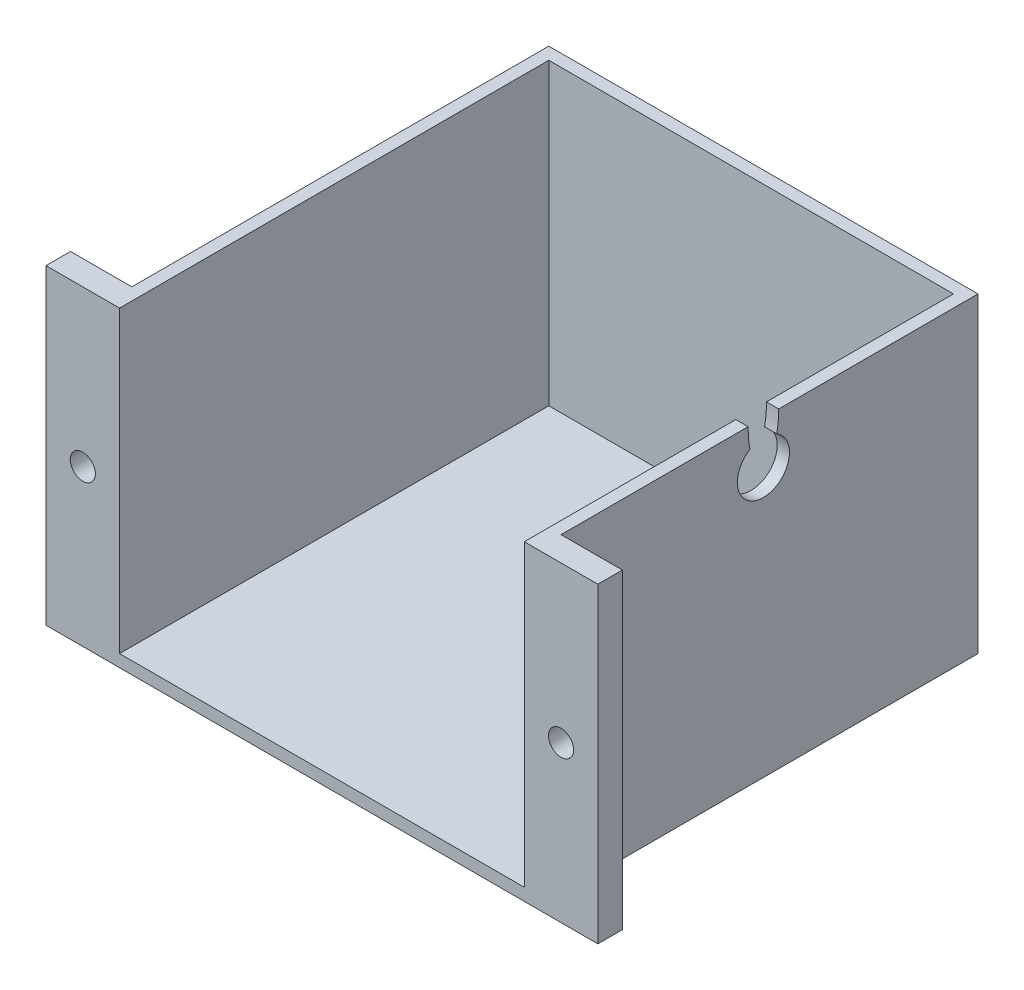
ISO-10303-21;
HEADER;
FILE_DESCRIPTION(('STEP AP214'),'2;1');
FILE_NAME('part.step','',(''),(''),'','','');
FILE_SCHEMA(('AUTOMOTIVE_DESIGN { 1 0 10303 214 1 1 1 1 }'));
ENDSEC;
DATA;
#1=APPLICATION_CONTEXT('core data for automotive mechanical design processes');
#2=APPLICATION_PROTOCOL_DEFINITION('international standard','automotive_design',2000,#1);
#3=PRODUCT_CONTEXT('',#1,'mechanical');
#4=PRODUCT('Part','Part','',(#3));
#5=PRODUCT_RELATED_PRODUCT_CATEGORY('part','',(#4));
#6=PRODUCT_DEFINITION_FORMATION('','',#4);
#7=PRODUCT_DEFINITION_CONTEXT('part definition',#1,'design');
#8=PRODUCT_DEFINITION('design','',#6,#7);
#9=PRODUCT_DEFINITION_SHAPE('','',#8);
#10=(LENGTH_UNIT() NAMED_UNIT(*) SI_UNIT(.MILLI.,.METRE.));
#11=(NAMED_UNIT(*) PLANE_ANGLE_UNIT() SI_UNIT($,.RADIAN.));
#12=(NAMED_UNIT(*) SI_UNIT($,.STERADIAN.) SOLID_ANGLE_UNIT());
#13=UNCERTAINTY_MEASURE_WITH_UNIT(LENGTH_MEASURE(1.E-05),#10,'distance_accuracy_value','');
#14=(GEOMETRIC_REPRESENTATION_CONTEXT(3) GLOBAL_UNCERTAINTY_ASSIGNED_CONTEXT((#13)) GLOBAL_UNIT_ASSIGNED_CONTEXT((#10,
#11,#12)) REPRESENTATION_CONTEXT('',''));
#15=CARTESIAN_POINT('',(0.,0.,0.));
#16=DIRECTION('',(0.,0.,1.));
#17=DIRECTION('',(1.,0.,0.));
#18=AXIS2_PLACEMENT_3D('',#15,#16,#17);
#19=CARTESIAN_POINT('',(0.,50.8,0.));
#20=DIRECTION('',(0.,-1.,0.));
#21=DIRECTION('',(0.,0.,-1.));
#22=AXIS2_PLACEMENT_3D('',#19,#20,#21);
#23=PLANE('',#22);
#24=DIRECTION('',(0.,0.,-1.));
#25=VECTOR('',#24,1.);
#26=CARTESIAN_POINT('',(70.,50.8,-68.));
#27=LINE('',#26,#25);
#28=CARTESIAN_POINT('',(70.,50.8,0.));
#29=VERTEX_POINT('',#28);
#30=CARTESIAN_POINT('',(70.,50.8,-30.5));
#31=VERTEX_POINT('',#30);
#32=EDGE_CURVE('E170',#29,#31,#27,.T.);
#33=ORIENTED_EDGE('',*,*,#32,.T.);
#34=DIRECTION('',(1.,0.,0.));
#35=VECTOR('',#34,1.);
#36=CARTESIAN_POINT('',(-10.001,50.8,-30.5));
#37=LINE('',#36,#35);
#38=CARTESIAN_POINT('',(68.,50.8,-30.5));
#39=VERTEX_POINT('',#38);
#40=EDGE_CURVE('E155',#39,#31,#37,.T.);
#41=ORIENTED_EDGE('',*,*,#40,.F.);
#42=DIRECTION('',(0.,0.,1.));
#43=VECTOR('',#42,1.);
#44=CARTESIAN_POINT('',(68.,50.8,3.99999999999999));
#45=LINE('',#44,#43);
#46=CARTESIAN_POINT('',(68.,50.8,3.99999999999999));
#47=VERTEX_POINT('',#46);
#48=EDGE_CURVE('E167',#39,#47,#45,.T.);
#49=ORIENTED_EDGE('',*,*,#48,.T.);
#50=DIRECTION('',(1.,0.,0.));
#51=VECTOR('',#50,1.);
#52=CARTESIAN_POINT('',(80.,50.8,3.99999999999999));
#53=LINE('',#52,#51);
#54=CARTESIAN_POINT('',(80.,50.8,3.99999999999999));
#55=VERTEX_POINT('',#54);
#56=EDGE_CURVE('E181',#47,#55,#53,.T.);
#57=ORIENTED_EDGE('',*,*,#56,.T.);
#58=DIRECTION('',(0.,0.,-1.));
#59=VECTOR('',#58,1.);
#60=CARTESIAN_POINT('',(80.,50.8,0.));
#61=LINE('',#60,#59);
#62=CARTESIAN_POINT('',(80.,50.8,0.));
#63=VERTEX_POINT('',#62);
#64=EDGE_CURVE('E187',#55,#63,#61,.T.);
#65=ORIENTED_EDGE('',*,*,#64,.T.);
#66=DIRECTION('',(-1.,0.,0.));
#67=VECTOR('',#66,1.);
#68=CARTESIAN_POINT('',(70.,50.8,0.));
#69=LINE('',#68,#67);
#70=EDGE_CURVE('E189',#63,#29,#69,.T.);
#71=ORIENTED_EDGE('',*,*,#70,.T.);
#72=EDGE_LOOP('',(#33,#41,#49,#57,#65,#71));
#73=FACE_BOUND('',#72,.T.);
#74=ADVANCED_FACE('F39',(#73),#23,.F.);
#75=CARTESIAN_POINT('',(2.,50.8,-66.));
#76=DIRECTION('',(-1.,0.,0.));
#77=DIRECTION('',(0.,0.,1.));
#78=AXIS2_PLACEMENT_3D('',#75,#76,#77);
#79=PLANE('',#78);
#80=DIRECTION('',(0.,0.,-1.));
#81=VECTOR('',#80,1.);
#82=CARTESIAN_POINT('',(1.99999999999998,2.,4.));
#83=LINE('',#82,#81);
#84=CARTESIAN_POINT('',(2.00000000000001,2.,4.));
#85=VERTEX_POINT('',#84);
#86=CARTESIAN_POINT('',(2.,2.,-66.));
#87=VERTEX_POINT('',#86);
#88=EDGE_CURVE('E257',#85,#87,#83,.T.);
#89=ORIENTED_EDGE('',*,*,#88,.T.);
#90=DIRECTION('',(0.,-1.,0.));
#91=VECTOR('',#90,1.);
#92=CARTESIAN_POINT('',(2.,50.8,-66.));
#93=LINE('',#92,#91);
#94=CARTESIAN_POINT('',(2.,50.8,-66.));
#95=VERTEX_POINT('',#94);
#96=EDGE_CURVE('E243',#95,#87,#93,.T.);
#97=ORIENTED_EDGE('',*,*,#96,.F.);
#98=DIRECTION('',(0.,0.,-1.));
#99=VECTOR('',#98,1.);
#100=CARTESIAN_POINT('',(2.,50.8,-66.));
#101=LINE('',#100,#99);
#102=CARTESIAN_POINT('',(2.00000000000001,50.8,4.));
#103=VERTEX_POINT('',#102);
#104=EDGE_CURVE('E182',#103,#95,#101,.T.);
#105=ORIENTED_EDGE('',*,*,#104,.F.);
#106=DIRECTION('',(0.,-1.,0.));
#107=VECTOR('',#106,1.);
#108=CARTESIAN_POINT('',(2.00000000000001,50.8,4.));
#109=LINE('',#108,#107);
#110=EDGE_CURVE('E47',#103,#85,#109,.T.);
#111=ORIENTED_EDGE('',*,*,#110,.T.);
#112=EDGE_LOOP('',(#89,#97,#105,#111));
#113=FACE_BOUND('',#112,.T.);
#114=ADVANCED_FACE('F274',(#113),#79,.F.);
#115=CARTESIAN_POINT('',(68.,50.8,-66.));
#116=DIRECTION('',(0.,0.,-1.));
#117=DIRECTION('',(-1.,0.,0.));
#118=AXIS2_PLACEMENT_3D('',#115,#116,#117);
#119=PLANE('',#118);
#120=DIRECTION('',(-1.,0.,0.));
#121=VECTOR('',#120,1.);
#122=CARTESIAN_POINT('',(1.99999999999998,2.,-66.));
#123=LINE('',#122,#121);
#124=CARTESIAN_POINT('',(68.,2.,-66.));
#125=VERTEX_POINT('',#124);
#126=EDGE_CURVE('E251',#125,#87,#123,.T.);
#127=ORIENTED_EDGE('',*,*,#126,.F.);
#128=DIRECTION('',(0.,-1.,0.));
#129=VECTOR('',#128,1.);
#130=CARTESIAN_POINT('',(68.,50.8,-66.));
#131=LINE('',#130,#129);
#132=CARTESIAN_POINT('',(68.,50.8,-66.));
#133=VERTEX_POINT('',#132);
#134=EDGE_CURVE('E240',#133,#125,#131,.T.);
#135=ORIENTED_EDGE('',*,*,#134,.F.);
#136=DIRECTION('',(1.,0.,0.));
#137=VECTOR('',#136,1.);
#138=CARTESIAN_POINT('',(68.,50.8,-66.));
#139=LINE('',#138,#137);
#140=EDGE_CURVE('E178',#95,#133,#139,.T.);
#141=ORIENTED_EDGE('',*,*,#140,.F.);
#142=ORIENTED_EDGE('',*,*,#96,.T.);
#143=EDGE_LOOP('',(#127,#135,#141,#142));
#144=FACE_BOUND('',#143,.T.);
#145=ADVANCED_FACE('F249',(#144),#119,.F.);
#146=CARTESIAN_POINT('',(68.,50.8,3.99999999999999));
#147=DIRECTION('',(1.,0.,0.));
#148=DIRECTION('',(0.,0.,-1.));
#149=AXIS2_PLACEMENT_3D('',#146,#147,#148);
#150=PLANE('',#149);
#151=ORIENTED_EDGE('',*,*,#48,.F.);
#152=CARTESIAN_POINT('',(68.,50.8,-33.));
#153=DIRECTION('',(1.,0.,0.));
#154=DIRECTION('',(0.,-1.,0.));
#155=AXIS2_PLACEMENT_3D('',#152,#153,#154);
#156=ELLIPSE('',#155,7.,2.50000000000001);
#157=CARTESIAN_POINT('',(68.,47.4403563768322,-30.8067591446317));
#158=VERTEX_POINT('',#157);
#159=EDGE_CURVE('E151',#158,#39,#156,.F.);
#160=ORIENTED_EDGE('',*,*,#159,.F.);
#161=CARTESIAN_POINT('',(68.,43.8,-33.));
#162=DIRECTION('',(1.,0.,0.));
#163=DIRECTION('',(0.,0.,-1.));
#164=AXIS2_PLACEMENT_3D('',#161,#162,#163);
#165=CIRCLE('',#164,4.25);
#166=CARTESIAN_POINT('',(68.,47.4403563768322,-35.1932408553683));
#167=VERTEX_POINT('',#166);
#168=EDGE_CURVE('E163',#167,#158,#165,.F.);
#169=ORIENTED_EDGE('',*,*,#168,.F.);
#170=CARTESIAN_POINT('',(68.,50.8,-33.));
#171=DIRECTION('',(1.,0.,0.));
#172=DIRECTION('',(0.,-1.,0.));
#173=AXIS2_PLACEMENT_3D('',#170,#171,#172);
#174=ELLIPSE('',#173,7.,2.50000000000001);
#175=CARTESIAN_POINT('',(68.,50.8,-35.5));
#176=VERTEX_POINT('',#175);
#177=EDGE_CURVE('E162',#176,#167,#174,.F.);
#178=ORIENTED_EDGE('',*,*,#177,.F.);
#179=EDGE_CURVE('E177',#133,#176,#45,.T.);
#180=ORIENTED_EDGE('',*,*,#179,.F.);
#181=ORIENTED_EDGE('',*,*,#134,.T.);
#182=DIRECTION('',(0.,0.,-1.));
#183=VECTOR('',#182,1.);
#184=CARTESIAN_POINT('',(68.,2.,4.));
#185=LINE('',#184,#183);
#186=CARTESIAN_POINT('',(68.,2.,3.99999999999999));
#187=VERTEX_POINT('',#186);
#188=EDGE_CURVE('E204',#187,#125,#185,.T.);
#189=ORIENTED_EDGE('',*,*,#188,.F.);
#190=DIRECTION('',(0.,-1.,0.));
#191=VECTOR('',#190,1.);
#192=CARTESIAN_POINT('',(68.,50.8,3.99999999999999));
#193=LINE('',#192,#191);
#194=EDGE_CURVE('E175',#47,#187,#193,.T.);
#195=ORIENTED_EDGE('',*,*,#194,.F.);
#196=EDGE_LOOP('',(#151,#160,#169,#178,#180,#181,#189,#195));
#197=FACE_BOUND('',#196,.T.);
#198=ADVANCED_FACE('F173',(#197),#150,.F.);
#199=CARTESIAN_POINT('',(-9.99999999999999,50.8,4.));
#200=DIRECTION('',(1.,0.,0.));
#201=DIRECTION('',(0.,0.,-1.));
#202=AXIS2_PLACEMENT_3D('',#199,#200,#201);
#203=PLANE('',#202);
#204=DIRECTION('',(0.,0.,1.));
#205=VECTOR('',#204,1.);
#206=CARTESIAN_POINT('',(-9.99999999999999,0.,4.));
#207=LINE('',#206,#205);
#208=CARTESIAN_POINT('',(-9.99999999999999,0.,0.));
#209=VERTEX_POINT('',#208);
#210=CARTESIAN_POINT('',(-9.99999999999999,0.,4.));
#211=VERTEX_POINT('',#210);
#212=EDGE_CURVE('E200',#209,#211,#207,.T.);
#213=ORIENTED_EDGE('',*,*,#212,.T.);
#214=DIRECTION('',(0.,-1.,0.));
#215=VECTOR('',#214,1.);
#216=CARTESIAN_POINT('',(-9.99999999999999,50.8,4.));
#217=LINE('',#216,#215);
#218=CARTESIAN_POINT('',(-9.99999999999999,50.8,4.));
#219=VERTEX_POINT('',#218);
#220=EDGE_CURVE('E11',#219,#211,#217,.T.);
#221=ORIENTED_EDGE('',*,*,#220,.F.);
#222=DIRECTION('',(0.,0.,1.));
#223=VECTOR('',#222,1.);
#224=CARTESIAN_POINT('',(-9.99999999999999,50.8,4.));
#225=LINE('',#224,#223);
#226=CARTESIAN_POINT('',(-9.99999999999999,50.8,0.));
#227=VERTEX_POINT('',#226);
#228=EDGE_CURVE('E218',#227,#219,#225,.T.);
#229=ORIENTED_EDGE('',*,*,#228,.F.);
#230=DIRECTION('',(0.,-1.,0.));
#231=VECTOR('',#230,1.);
#232=CARTESIAN_POINT('',(-9.99999999999999,50.8,0.));
#233=LINE('',#232,#231);
#234=EDGE_CURVE('E199',#227,#209,#233,.T.);
#235=ORIENTED_EDGE('',*,*,#234,.T.);
#236=EDGE_LOOP('',(#213,#221,#229,#235));
#237=FACE_BOUND('',#236,.T.);
#238=ADVANCED_FACE('F41',(#237),#203,.F.);
#239=CARTESIAN_POINT('',(80.,50.8,3.99999999999999));
#240=DIRECTION('',(0.,0.,-1.));
#241=DIRECTION('',(-1.,0.,0.));
#242=AXIS2_PLACEMENT_3D('',#239,#240,#241);
#243=PLANE('',#242);
#244=CARTESIAN_POINT('',(74.,25.4,4.));
#245=DIRECTION('',(0.,0.,1.));
#246=DIRECTION('',(1.,0.,0.));
#247=AXIS2_PLACEMENT_3D('',#244,#245,#246);
#248=CIRCLE('',#247,2.04999999999999);
#249=CARTESIAN_POINT('',(76.05,25.4,4.));
#250=VERTEX_POINT('',#249);
#251=EDGE_CURVE('E263',#250,#250,#248,.T.);
#252=ORIENTED_EDGE('',*,*,#251,.F.);
#253=EDGE_LOOP('',(#252));
#254=FACE_BOUND('',#253,.T.);
#255=CARTESIAN_POINT('',(-4.,25.4,4.));
#256=DIRECTION('',(0.,0.,1.));
#257=DIRECTION('',(1.,0.,0.));
#258=AXIS2_PLACEMENT_3D('',#255,#256,#257);
#259=CIRCLE('',#258,2.05);
#260=CARTESIAN_POINT('',(-1.95,25.4,4.));
#261=VERTEX_POINT('',#260);
#262=EDGE_CURVE('E340',#261,#261,#259,.T.);
#263=ORIENTED_EDGE('',*,*,#262,.F.);
#264=EDGE_LOOP('',(#263));
#265=FACE_BOUND('',#264,.T.);
#266=DIRECTION('',(1.,0.,0.));
#267=VECTOR('',#266,1.);
#268=CARTESIAN_POINT('',(80.,0.,3.99999999999999));
#269=LINE('',#268,#267);
#270=CARTESIAN_POINT('',(80.,0.,3.99999999999999));
#271=VERTEX_POINT('',#270);
#272=EDGE_CURVE('E203',#211,#271,#269,.T.);
#273=ORIENTED_EDGE('',*,*,#272,.T.);
#274=DIRECTION('',(0.,-1.,0.));
#275=VECTOR('',#274,1.);
#276=CARTESIAN_POINT('',(80.,50.8,3.99999999999999));
#277=LINE('',#276,#275);
#278=EDGE_CURVE('E236',#55,#271,#277,.T.);
#279=ORIENTED_EDGE('',*,*,#278,.F.);
#280=ORIENTED_EDGE('',*,*,#56,.F.);
#281=ORIENTED_EDGE('',*,*,#194,.T.);
#282=DIRECTION('',(-1.,0.,0.));
#283=VECTOR('',#282,1.);
#284=CARTESIAN_POINT('',(1.99999999999998,2.,4.));
#285=LINE('',#284,#283);
#286=EDGE_CURVE('E258',#187,#85,#285,.T.);
#287=ORIENTED_EDGE('',*,*,#286,.T.);
#288=ORIENTED_EDGE('',*,*,#110,.F.);
#289=DIRECTION('',(1.,0.,0.));
#290=VECTOR('',#289,1.);
#291=CARTESIAN_POINT('',(2.00000000000001,50.8,4.));
#292=LINE('',#291,#290);
#293=EDGE_CURVE('E271',#219,#103,#292,.T.);
#294=ORIENTED_EDGE('',*,*,#293,.F.);
#295=ORIENTED_EDGE('',*,*,#220,.T.);
#296=EDGE_LOOP('',(#273,#279,#280,#281,#287,#288,#294,#295));
#297=FACE_BOUND('',#296,.T.);
#298=ADVANCED_FACE('F286',(#254,#265,#297),#243,.F.);
#299=CARTESIAN_POINT('',(80.,50.8,0.));
#300=DIRECTION('',(-1.,0.,0.));
#301=DIRECTION('',(0.,0.,1.));
#302=AXIS2_PLACEMENT_3D('',#299,#300,#301);
#303=PLANE('',#302);
#304=DIRECTION('',(0.,0.,-1.));
#305=VECTOR('',#304,1.);
#306=CARTESIAN_POINT('',(80.,0.,0.));
#307=LINE('',#306,#305);
#308=CARTESIAN_POINT('',(80.,0.,0.));
#309=VERTEX_POINT('',#308);
#310=EDGE_CURVE('E206',#271,#309,#307,.T.);
#311=ORIENTED_EDGE('',*,*,#310,.T.);
#312=DIRECTION('',(0.,-1.,0.));
#313=VECTOR('',#312,1.);
#314=CARTESIAN_POINT('',(80.,50.8,0.));
#315=LINE('',#314,#313);
#316=EDGE_CURVE('E233',#63,#309,#315,.T.);
#317=ORIENTED_EDGE('',*,*,#316,.F.);
#318=ORIENTED_EDGE('',*,*,#64,.F.);
#319=ORIENTED_EDGE('',*,*,#278,.T.);
#320=EDGE_LOOP('',(#311,#317,#318,#319));
#321=FACE_BOUND('',#320,.T.);
#322=ADVANCED_FACE('F289',(#321),#303,.F.);
#323=CARTESIAN_POINT('',(70.,50.8,0.));
#324=DIRECTION('',(0.,0.,1.));
#325=DIRECTION('',(1.,0.,0.));
#326=AXIS2_PLACEMENT_3D('',#323,#324,#325);
#327=PLANE('',#326);
#328=CARTESIAN_POINT('',(74.,25.4,0.));
#329=DIRECTION('',(0.,0.,1.));
#330=DIRECTION('',(1.,0.,0.));
#331=AXIS2_PLACEMENT_3D('',#328,#329,#330);
#332=CIRCLE('',#331,2.04999999999999);
#333=CARTESIAN_POINT('',(76.05,25.4,0.));
#334=VERTEX_POINT('',#333);
#335=EDGE_CURVE('E259',#334,#334,#332,.T.);
#336=ORIENTED_EDGE('',*,*,#335,.T.);
#337=EDGE_LOOP('',(#336));
#338=FACE_BOUND('',#337,.T.);
#339=DIRECTION('',(-1.,0.,0.));
#340=VECTOR('',#339,1.);
#341=CARTESIAN_POINT('',(70.,0.,0.));
#342=LINE('',#341,#340);
#343=CARTESIAN_POINT('',(70.,0.,0.));
#344=VERTEX_POINT('',#343);
#345=EDGE_CURVE('E208',#309,#344,#342,.T.);
#346=ORIENTED_EDGE('',*,*,#345,.T.);
#347=DIRECTION('',(0.,-1.,0.));
#348=VECTOR('',#347,1.);
#349=CARTESIAN_POINT('',(70.,50.8,0.));
#350=LINE('',#349,#348);
#351=EDGE_CURVE('E230',#29,#344,#350,.T.);
#352=ORIENTED_EDGE('',*,*,#351,.F.);
#353=ORIENTED_EDGE('',*,*,#70,.F.);
#354=ORIENTED_EDGE('',*,*,#316,.T.);
#355=EDGE_LOOP('',(#346,#352,#353,#354));
#356=FACE_BOUND('',#355,.T.);
#357=ADVANCED_FACE('F293',(#338,#356),#327,.F.);
#358=CARTESIAN_POINT('',(70.,50.8,-68.));
#359=DIRECTION('',(-1.,0.,0.));
#360=DIRECTION('',(0.,0.,1.));
#361=AXIS2_PLACEMENT_3D('',#358,#359,#360);
#362=PLANE('',#361);
#363=CARTESIAN_POINT('',(70.,43.8,-33.));
#364=DIRECTION('',(1.,0.,0.));
#365=DIRECTION('',(0.,0.,-1.));
#366=AXIS2_PLACEMENT_3D('',#363,#364,#365);
#367=CIRCLE('',#366,4.25);
#368=CARTESIAN_POINT('',(70.,47.4403563768322,-30.8067591446317));
#369=VERTEX_POINT('',#368);
#370=CARTESIAN_POINT('',(70.,47.4403563768322,-35.1932408553683));
#371=VERTEX_POINT('',#370);
#372=EDGE_CURVE('E357',#369,#371,#367,.T.);
#373=ORIENTED_EDGE('',*,*,#372,.F.);
#374=CARTESIAN_POINT('',(70.,50.8,-33.));
#375=DIRECTION('',(1.,0.,0.));
#376=DIRECTION('',(0.,-1.,0.));
#377=AXIS2_PLACEMENT_3D('',#374,#375,#376);
#378=ELLIPSE('',#377,7.,2.50000000000001);
#379=EDGE_CURVE('E352',#31,#369,#378,.T.);
#380=ORIENTED_EDGE('',*,*,#379,.F.);
#381=ORIENTED_EDGE('',*,*,#32,.F.);
#382=ORIENTED_EDGE('',*,*,#351,.T.);
#383=DIRECTION('',(0.,0.,-1.));
#384=VECTOR('',#383,1.);
#385=CARTESIAN_POINT('',(70.,0.,-68.));
#386=LINE('',#385,#384);
#387=CARTESIAN_POINT('',(70.,0.,-68.));
#388=VERTEX_POINT('',#387);
#389=EDGE_CURVE('E210',#344,#388,#386,.T.);
#390=ORIENTED_EDGE('',*,*,#389,.T.);
#391=DIRECTION('',(0.,-1.,0.));
#392=VECTOR('',#391,1.);
#393=CARTESIAN_POINT('',(70.,50.8,-68.));
#394=LINE('',#393,#392);
#395=CARTESIAN_POINT('',(70.,50.8,-68.));
#396=VERTEX_POINT('',#395);
#397=EDGE_CURVE('E227',#396,#388,#394,.T.);
#398=ORIENTED_EDGE('',*,*,#397,.F.);
#399=CARTESIAN_POINT('',(70.,50.8,-35.5));
#400=VERTEX_POINT('',#399);
#401=EDGE_CURVE('E191',#400,#396,#27,.T.);
#402=ORIENTED_EDGE('',*,*,#401,.F.);
#403=CARTESIAN_POINT('',(70.,50.8,-33.));
#404=DIRECTION('',(1.,0.,0.));
#405=DIRECTION('',(0.,-1.,0.));
#406=AXIS2_PLACEMENT_3D('',#403,#404,#405);
#407=ELLIPSE('',#406,7.,2.50000000000001);
#408=EDGE_CURVE('E54',#371,#400,#407,.T.);
#409=ORIENTED_EDGE('',*,*,#408,.F.);
#410=EDGE_LOOP('',(#373,#380,#381,#382,#390,#398,#402,#409));
#411=FACE_BOUND('',#410,.T.);
#412=ADVANCED_FACE('F297',(#411),#362,.F.);
#413=CARTESIAN_POINT('',(0.,50.8,-68.));
#414=DIRECTION('',(0.,0.,1.));
#415=DIRECTION('',(1.,0.,0.));
#416=AXIS2_PLACEMENT_3D('',#413,#414,#415);
#417=PLANE('',#416);
#418=DIRECTION('',(-1.,0.,0.));
#419=VECTOR('',#418,1.);
#420=CARTESIAN_POINT('',(0.,0.,-68.));
#421=LINE('',#420,#419);
#422=CARTESIAN_POINT('',(0.,0.,-68.));
#423=VERTEX_POINT('',#422);
#424=EDGE_CURVE('E212',#388,#423,#421,.T.);
#425=ORIENTED_EDGE('',*,*,#424,.T.);
#426=DIRECTION('',(0.,-1.,0.));
#427=VECTOR('',#426,1.);
#428=CARTESIAN_POINT('',(0.,50.8,-68.));
#429=LINE('',#428,#427);
#430=CARTESIAN_POINT('',(0.,50.8,-68.));
#431=VERTEX_POINT('',#430);
#432=EDGE_CURVE('E224',#431,#423,#429,.T.);
#433=ORIENTED_EDGE('',*,*,#432,.F.);
#434=DIRECTION('',(-1.,0.,0.));
#435=VECTOR('',#434,1.);
#436=CARTESIAN_POINT('',(0.,50.8,-68.));
#437=LINE('',#436,#435);
#438=EDGE_CURVE('E193',#396,#431,#437,.T.);
#439=ORIENTED_EDGE('',*,*,#438,.F.);
#440=ORIENTED_EDGE('',*,*,#397,.T.);
#441=EDGE_LOOP('',(#425,#433,#439,#440));
#442=FACE_BOUND('',#441,.T.);
#443=ADVANCED_FACE('F301',(#442),#417,.F.);
#444=CARTESIAN_POINT('',(0.,50.8,0.));
#445=DIRECTION('',(1.,0.,0.));
#446=DIRECTION('',(0.,0.,-1.));
#447=AXIS2_PLACEMENT_3D('',#444,#445,#446);
#448=PLANE('',#447);
#449=DIRECTION('',(0.,0.,1.));
#450=VECTOR('',#449,1.);
#451=CARTESIAN_POINT('',(0.,0.,0.));
#452=LINE('',#451,#450);
#453=CARTESIAN_POINT('',(0.,0.,0.));
#454=VERTEX_POINT('',#453);
#455=EDGE_CURVE('E214',#423,#454,#452,.T.);
#456=ORIENTED_EDGE('',*,*,#455,.T.);
#457=DIRECTION('',(0.,-1.,0.));
#458=VECTOR('',#457,1.);
#459=CARTESIAN_POINT('',(0.,50.8,0.));
#460=LINE('',#459,#458);
#461=CARTESIAN_POINT('',(0.,50.8,0.));
#462=VERTEX_POINT('',#461);
#463=EDGE_CURVE('E221',#462,#454,#460,.T.);
#464=ORIENTED_EDGE('',*,*,#463,.F.);
#465=DIRECTION('',(0.,0.,1.));
#466=VECTOR('',#465,1.);
#467=CARTESIAN_POINT('',(0.,50.8,0.));
#468=LINE('',#467,#466);
#469=EDGE_CURVE('E195',#431,#462,#468,.T.);
#470=ORIENTED_EDGE('',*,*,#469,.F.);
#471=ORIENTED_EDGE('',*,*,#432,.T.);
#472=EDGE_LOOP('',(#456,#464,#470,#471));
#473=FACE_BOUND('',#472,.T.);
#474=ADVANCED_FACE('F305',(#473),#448,.F.);
#475=CARTESIAN_POINT('',(-9.99999999999999,50.8,0.));
#476=DIRECTION('',(0.,0.,1.));
#477=DIRECTION('',(1.,0.,0.));
#478=AXIS2_PLACEMENT_3D('',#475,#476,#477);
#479=PLANE('',#478);
#480=CARTESIAN_POINT('',(-4.,25.4,0.));
#481=DIRECTION('',(0.,0.,1.));
#482=DIRECTION('',(1.,0.,0.));
#483=AXIS2_PLACEMENT_3D('',#480,#481,#482);
#484=CIRCLE('',#483,2.05);
#485=CARTESIAN_POINT('',(-1.95,25.4,0.));
#486=VERTEX_POINT('',#485);
#487=EDGE_CURVE('E342',#486,#486,#484,.T.);
#488=ORIENTED_EDGE('',*,*,#487,.T.);
#489=EDGE_LOOP('',(#488));
#490=FACE_BOUND('',#489,.T.);
#491=DIRECTION('',(-1.,0.,0.));
#492=VECTOR('',#491,1.);
#493=CARTESIAN_POINT('',(-9.99999999999999,0.,0.));
#494=LINE('',#493,#492);
#495=EDGE_CURVE('E216',#454,#209,#494,.T.);
#496=ORIENTED_EDGE('',*,*,#495,.T.);
#497=ORIENTED_EDGE('',*,*,#234,.F.);
#498=DIRECTION('',(-1.,0.,0.));
#499=VECTOR('',#498,1.);
#500=CARTESIAN_POINT('',(-9.99999999999999,50.8,0.));
#501=LINE('',#500,#499);
#502=EDGE_CURVE('E197',#462,#227,#501,.T.);
#503=ORIENTED_EDGE('',*,*,#502,.F.);
#504=ORIENTED_EDGE('',*,*,#463,.T.);
#505=EDGE_LOOP('',(#496,#497,#503,#504));
#506=FACE_BOUND('',#505,.T.);
#507=ADVANCED_FACE('F308',(#490,#506),#479,.F.);
#508=ORIENTED_EDGE('',*,*,#179,.T.);
#509=DIRECTION('',(1.,0.,0.));
#510=VECTOR('',#509,1.);
#511=CARTESIAN_POINT('',(-10.001,50.8,-35.5));
#512=LINE('',#511,#510);
#513=EDGE_CURVE('E171',#176,#400,#512,.T.);
#514=ORIENTED_EDGE('',*,*,#513,.T.);
#515=ORIENTED_EDGE('',*,*,#401,.T.);
#516=ORIENTED_EDGE('',*,*,#438,.T.);
#517=ORIENTED_EDGE('',*,*,#469,.T.);
#518=ORIENTED_EDGE('',*,*,#502,.T.);
#519=ORIENTED_EDGE('',*,*,#228,.T.);
#520=ORIENTED_EDGE('',*,*,#293,.T.);
#521=ORIENTED_EDGE('',*,*,#104,.T.);
#522=ORIENTED_EDGE('',*,*,#140,.T.);
#523=EDGE_LOOP('',(#508,#514,#515,#516,#517,#518,#519,#520,#521,#522));
#524=FACE_BOUND('',#523,.T.);
#525=ADVANCED_FACE('F273',(#524),#23,.F.);
#526=CARTESIAN_POINT('',(0.,0.,0.));
#527=DIRECTION('',(0.,-1.,0.));
#528=DIRECTION('',(0.,0.,-1.));
#529=AXIS2_PLACEMENT_3D('',#526,#527,#528);
#530=PLANE('',#529);
#531=ORIENTED_EDGE('',*,*,#272,.F.);
#532=ORIENTED_EDGE('',*,*,#212,.F.);
#533=ORIENTED_EDGE('',*,*,#495,.F.);
#534=ORIENTED_EDGE('',*,*,#455,.F.);
#535=ORIENTED_EDGE('',*,*,#424,.F.);
#536=ORIENTED_EDGE('',*,*,#389,.F.);
#537=ORIENTED_EDGE('',*,*,#345,.F.);
#538=ORIENTED_EDGE('',*,*,#310,.F.);
#539=EDGE_LOOP('',(#531,#532,#533,#534,#535,#536,#537,#538));
#540=FACE_BOUND('',#539,.T.);
#541=ADVANCED_FACE('F313',(#540),#530,.T.);
#542=CARTESIAN_POINT('',(1.99999999999998,2.,4.));
#543=DIRECTION('',(0.,-1.,0.));
#544=DIRECTION('',(0.,0.,-1.));
#545=AXIS2_PLACEMENT_3D('',#542,#543,#544);
#546=PLANE('',#545);
#547=ORIENTED_EDGE('',*,*,#126,.T.);
#548=ORIENTED_EDGE('',*,*,#88,.F.);
#549=ORIENTED_EDGE('',*,*,#286,.F.);
#550=ORIENTED_EDGE('',*,*,#188,.T.);
#551=EDGE_LOOP('',(#547,#548,#549,#550));
#552=FACE_BOUND('',#551,.T.);
#553=ADVANCED_FACE('F255',(#552),#546,.F.);
#554=CARTESIAN_POINT('',(-4.,25.4,0.));
#555=DIRECTION('',(0.,0.,1.));
#556=DIRECTION('',(1.,0.,0.));
#557=AXIS2_PLACEMENT_3D('',#554,#555,#556);
#558=CYLINDRICAL_SURFACE('',#557,2.05);
#559=ORIENTED_EDGE('',*,*,#487,.F.);
#560=EDGE_LOOP('',(#559));
#561=FACE_BOUND('',#560,.T.);
#562=ORIENTED_EDGE('',*,*,#262,.T.);
#563=EDGE_LOOP('',(#562));
#564=FACE_BOUND('',#563,.T.);
#565=ADVANCED_FACE('F320',(#561,#564),#558,.F.);
#566=CARTESIAN_POINT('',(74.,25.4,0.));
#567=DIRECTION('',(0.,0.,1.));
#568=DIRECTION('',(1.,0.,0.));
#569=AXIS2_PLACEMENT_3D('',#566,#567,#568);
#570=CYLINDRICAL_SURFACE('',#569,2.04999999999999);
#571=ORIENTED_EDGE('',*,*,#335,.F.);
#572=EDGE_LOOP('',(#571));
#573=FACE_BOUND('',#572,.T.);
#574=ORIENTED_EDGE('',*,*,#251,.T.);
#575=EDGE_LOOP('',(#574));
#576=FACE_BOUND('',#575,.T.);
#577=ADVANCED_FACE('F323',(#573,#576),#570,.F.);
#578=CARTESIAN_POINT('',(-10.001,50.8,-33.));
#579=DIRECTION('',(1.,0.,0.));
#580=DIRECTION('',(0.,-1.,0.));
#581=AXIS2_PLACEMENT_3D('',#578,#579,#580);
#582=ELLIPSE('',#581,7.,2.50000000000001);
#583=DIRECTION('',(1.,0.,0.));
#584=VECTOR('',#583,1.);
#585=SURFACE_OF_LINEAR_EXTRUSION('',#582,#584);
#586=ORIENTED_EDGE('',*,*,#159,.T.);
#587=ORIENTED_EDGE('',*,*,#40,.T.);
#588=ORIENTED_EDGE('',*,*,#379,.T.);
#589=DIRECTION('',(1.,0.,0.));
#590=VECTOR('',#589,1.);
#591=CARTESIAN_POINT('',(-10.001,47.4403563768322,-30.8067591446317));
#592=LINE('',#591,#590);
#593=EDGE_CURVE('E157',#158,#369,#592,.T.);
#594=ORIENTED_EDGE('',*,*,#593,.F.);
#595=EDGE_LOOP('',(#586,#587,#588,#594));
#596=FACE_BOUND('',#595,.T.);
#597=ADVANCED_FACE('F153',(#596),#585,.F.);
#598=CARTESIAN_POINT('',(-10.001,50.8,-33.));
#599=DIRECTION('',(1.,0.,0.));
#600=DIRECTION('',(0.,-1.,0.));
#601=AXIS2_PLACEMENT_3D('',#598,#599,#600);
#602=ELLIPSE('',#601,7.,2.50000000000001);
#603=DIRECTION('',(1.,0.,0.));
#604=VECTOR('',#603,1.);
#605=SURFACE_OF_LINEAR_EXTRUSION('',#602,#604);
#606=ORIENTED_EDGE('',*,*,#177,.T.);
#607=DIRECTION('',(1.,0.,0.));
#608=VECTOR('',#607,1.);
#609=CARTESIAN_POINT('',(-10.001,47.4403563768322,-35.1932408553683));
#610=LINE('',#609,#608);
#611=EDGE_CURVE('E351',#167,#371,#610,.T.);
#612=ORIENTED_EDGE('',*,*,#611,.T.);
#613=ORIENTED_EDGE('',*,*,#408,.T.);
#614=ORIENTED_EDGE('',*,*,#513,.F.);
#615=EDGE_LOOP('',(#606,#612,#613,#614));
#616=FACE_BOUND('',#615,.T.);
#617=ADVANCED_FACE('F331',(#616),#605,.F.);
#618=CARTESIAN_POINT('',(-10.001,43.8,-33.));
#619=DIRECTION('',(1.,0.,0.));
#620=DIRECTION('',(0.,0.,-1.));
#621=AXIS2_PLACEMENT_3D('',#618,#619,#620);
#622=CYLINDRICAL_SURFACE('',#621,4.25);
#623=ORIENTED_EDGE('',*,*,#168,.T.);
#624=ORIENTED_EDGE('',*,*,#593,.T.);
#625=ORIENTED_EDGE('',*,*,#372,.T.);
#626=ORIENTED_EDGE('',*,*,#611,.F.);
#627=EDGE_LOOP('',(#623,#624,#625,#626));
#628=FACE_BOUND('',#627,.T.);
#629=ADVANCED_FACE('F355',(#628),#622,.F.);
#630=CLOSED_SHELL('',(#74,#114,#145,#198,#238,#298,#322,#357,#412,#443,#474,#507,#525,#541,#553,
#565,#577,#597,#617,#629));
#631=MANIFOLD_SOLID_BREP('B2',#630);
#632=ADVANCED_BREP_SHAPE_REPRESENTATION('',(#18,#631),#14);
#633=SHAPE_DEFINITION_REPRESENTATION(#9,#632);
ENDSEC;
END-ISO-10303-21;
